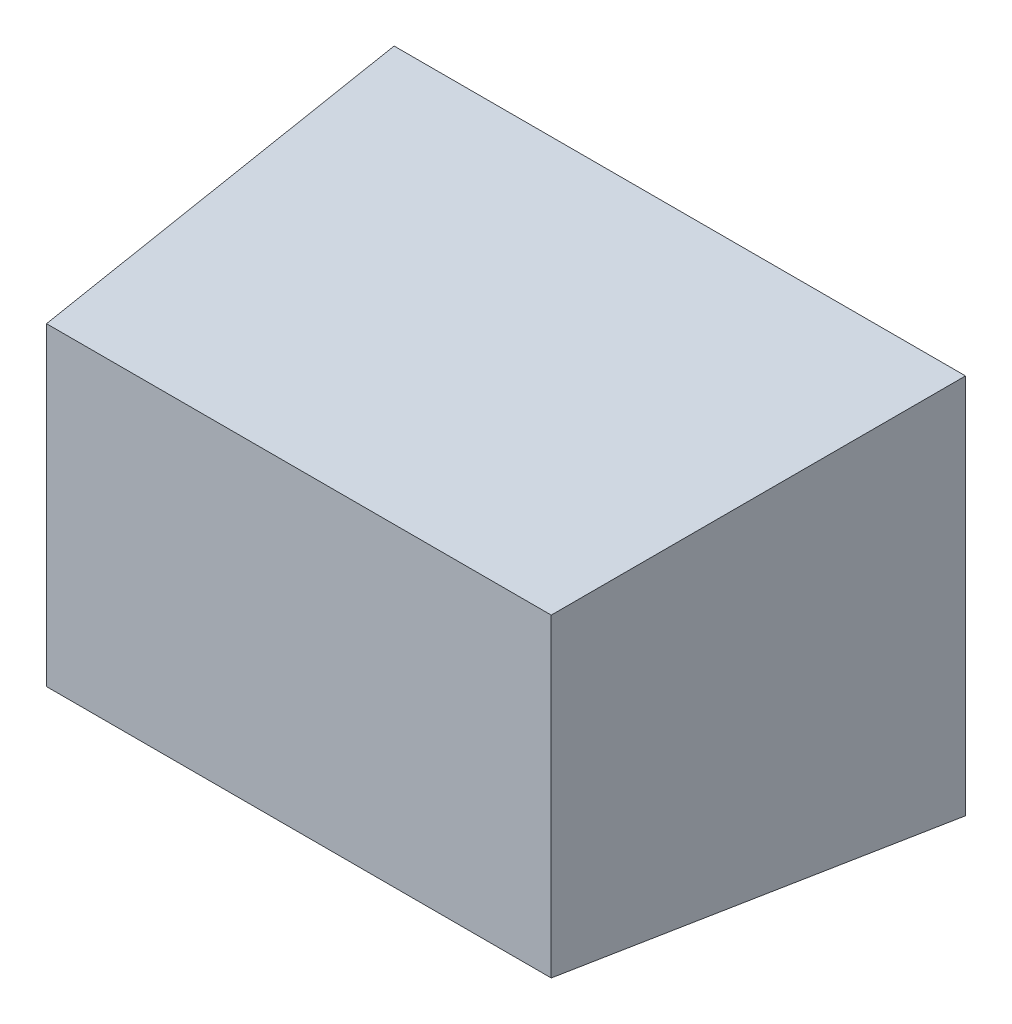
ISO-10303-21;
HEADER;
FILE_DESCRIPTION(('STEP AP214'),'2;1');
FILE_NAME('part.step','',(''),(''),'','','');
FILE_SCHEMA(('AUTOMOTIVE_DESIGN { 1 0 10303 214 1 1 1 1 }'));
ENDSEC;
DATA;
#1=APPLICATION_CONTEXT('core data for automotive mechanical design processes');
#2=APPLICATION_PROTOCOL_DEFINITION('international standard','automotive_design',2000,#1);
#3=PRODUCT_CONTEXT('',#1,'mechanical');
#4=PRODUCT('Part','Part','',(#3));
#5=PRODUCT_RELATED_PRODUCT_CATEGORY('part','',(#4));
#6=PRODUCT_DEFINITION_FORMATION('','',#4);
#7=PRODUCT_DEFINITION_CONTEXT('part definition',#1,'design');
#8=PRODUCT_DEFINITION('design','',#6,#7);
#9=PRODUCT_DEFINITION_SHAPE('','',#8);
#10=(LENGTH_UNIT() NAMED_UNIT(*) SI_UNIT(.MILLI.,.METRE.));
#11=(NAMED_UNIT(*) PLANE_ANGLE_UNIT() SI_UNIT($,.RADIAN.));
#12=(NAMED_UNIT(*) SI_UNIT($,.STERADIAN.) SOLID_ANGLE_UNIT());
#13=UNCERTAINTY_MEASURE_WITH_UNIT(LENGTH_MEASURE(1.E-05),#10,'distance_accuracy_value','');
#14=(GEOMETRIC_REPRESENTATION_CONTEXT(3) GLOBAL_UNCERTAINTY_ASSIGNED_CONTEXT((#13)) GLOBAL_UNIT_ASSIGNED_CONTEXT((#10,
#11,#12)) REPRESENTATION_CONTEXT('',''));
#15=CARTESIAN_POINT('',(0.,0.,0.));
#16=DIRECTION('',(0.,0.,1.));
#17=DIRECTION('',(1.,0.,0.));
#18=AXIS2_PLACEMENT_3D('',#15,#16,#17);
#19=CARTESIAN_POINT('',(75.,50.,0.));
#20=DIRECTION('',(0.996194698091746,0.,0.0871557427476584));
#21=DIRECTION('',(0.0871557427476584,0.,-0.996194698091746));
#22=AXIS2_PLACEMENT_3D('',#19,#20,#21);
#23=PLANE('',#22);
#24=DIRECTION('',(0.,1.,0.));
#25=VECTOR('',#24,1.);
#26=CARTESIAN_POINT('',(75.,50.,0.));
#27=LINE('',#26,#25);
#28=CARTESIAN_POINT('',(75.,-50.,0.));
#29=VERTEX_POINT('',#28);
#30=CARTESIAN_POINT('',(75.,50.,0.));
#31=VERTEX_POINT('',#30);
#32=EDGE_CURVE('E90',#29,#31,#27,.T.);
#33=ORIENTED_EDGE('',*,*,#32,.T.);
#34=DIRECTION('',(0.0868265938642478,0.0868265938642478,-0.992432509138967));
#35=VECTOR('',#34,1.);
#36=CARTESIAN_POINT('',(73.86917138969,48.86917138969,12.9254301613028));
#37=LINE('',#36,#35);
#38=CARTESIAN_POINT('',(66.2511336474076,41.2511336474076,100.));
#39=VERTEX_POINT('',#38);
#40=EDGE_CURVE('E11',#39,#31,#37,.T.);
#41=ORIENTED_EDGE('',*,*,#40,.F.);
#42=DIRECTION('',(0.,-1.,0.));
#43=VECTOR('',#42,1.);
#44=CARTESIAN_POINT('',(66.2511336474076,50.,100.));
#45=LINE('',#44,#43);
#46=CARTESIAN_POINT('',(66.2511336474076,-41.2511336474076,100.));
#47=VERTEX_POINT('',#46);
#48=EDGE_CURVE('E110',#47,#39,#45,.F.);
#49=ORIENTED_EDGE('',*,*,#48,.F.);
#50=DIRECTION('',(0.0868265938642478,-0.0868265938642478,-0.992432509138967));
#51=VECTOR('',#50,1.);
#52=CARTESIAN_POINT('',(74.2461142597933,-49.2461142597933,8.61695344086855));
#53=LINE('',#52,#51);
#54=EDGE_CURVE('E102',#47,#29,#53,.T.);
#55=ORIENTED_EDGE('',*,*,#54,.T.);
#56=EDGE_LOOP('',(#33,#41,#49,#55));
#57=FACE_BOUND('',#56,.T.);
#58=ADVANCED_FACE('F43',(#57),#23,.T.);
#59=CARTESIAN_POINT('',(-75.,50.,0.));
#60=DIRECTION('',(0.,0.996194698091746,0.0871557427476584));
#61=DIRECTION('',(0.,-0.0871557427476584,0.996194698091746));
#62=AXIS2_PLACEMENT_3D('',#59,#60,#61);
#63=PLANE('',#62);
#64=DIRECTION('',(-1.,0.,0.));
#65=VECTOR('',#64,1.);
#66=CARTESIAN_POINT('',(-75.,50.,0.));
#67=LINE('',#66,#65);
#68=CARTESIAN_POINT('',(-75.,50.,0.));
#69=VERTEX_POINT('',#68);
#70=EDGE_CURVE('E86',#31,#69,#67,.T.);
#71=ORIENTED_EDGE('',*,*,#70,.T.);
#72=DIRECTION('',(-0.0868265938642478,0.0868265938642478,-0.992432509138967));
#73=VECTOR('',#72,1.);
#74=CARTESIAN_POINT('',(-75.,50.,0.));
#75=LINE('',#74,#73);
#76=CARTESIAN_POINT('',(-66.2511336474076,41.2511336474076,100.));
#77=VERTEX_POINT('',#76);
#78=EDGE_CURVE('E53',#77,#69,#75,.T.);
#79=ORIENTED_EDGE('',*,*,#78,.F.);
#80=DIRECTION('',(1.,0.,0.));
#81=VECTOR('',#80,1.);
#82=CARTESIAN_POINT('',(-75.,41.2511336474076,100.));
#83=LINE('',#82,#81);
#84=EDGE_CURVE('E98',#39,#77,#83,.F.);
#85=ORIENTED_EDGE('',*,*,#84,.F.);
#86=ORIENTED_EDGE('',*,*,#40,.T.);
#87=EDGE_LOOP('',(#71,#79,#85,#86));
#88=FACE_BOUND('',#87,.T.);
#89=ADVANCED_FACE('F45',(#88),#63,.T.);
#90=CARTESIAN_POINT('',(-75.,50.,0.));
#91=DIRECTION('',(-0.996194698091746,0.,0.0871557427476584));
#92=DIRECTION('',(0.0871557427476584,0.,0.996194698091746));
#93=AXIS2_PLACEMENT_3D('',#90,#91,#92);
#94=PLANE('',#93);
#95=DIRECTION('',(0.,-1.,0.));
#96=VECTOR('',#95,1.);
#97=CARTESIAN_POINT('',(-75.,50.,0.));
#98=LINE('',#97,#96);
#99=CARTESIAN_POINT('',(-75.,-50.,0.));
#100=VERTEX_POINT('',#99);
#101=EDGE_CURVE('E91',#69,#100,#98,.T.);
#102=ORIENTED_EDGE('',*,*,#101,.T.);
#103=DIRECTION('',(-0.0868265938642478,-0.0868265938642478,-0.992432509138967));
#104=VECTOR('',#103,1.);
#105=CARTESIAN_POINT('',(-75.,-50.,0.));
#106=LINE('',#105,#104);
#107=CARTESIAN_POINT('',(-66.2511336474075,-41.2511336474076,100.));
#108=VERTEX_POINT('',#107);
#109=EDGE_CURVE('E114',#108,#100,#106,.T.);
#110=ORIENTED_EDGE('',*,*,#109,.F.);
#111=DIRECTION('',(0.,1.,0.));
#112=VECTOR('',#111,1.);
#113=CARTESIAN_POINT('',(-66.2511336474076,50.,100.));
#114=LINE('',#113,#112);
#115=EDGE_CURVE('E65',#77,#108,#114,.F.);
#116=ORIENTED_EDGE('',*,*,#115,.F.);
#117=ORIENTED_EDGE('',*,*,#78,.T.);
#118=EDGE_LOOP('',(#102,#110,#116,#117));
#119=FACE_BOUND('',#118,.T.);
#120=ADVANCED_FACE('F127',(#119),#94,.T.);
#121=CARTESIAN_POINT('',(-75.,-50.,0.));
#122=DIRECTION('',(0.,-0.996194698091746,0.0871557427476584));
#123=DIRECTION('',(0.,-0.0871557427476584,-0.996194698091746));
#124=AXIS2_PLACEMENT_3D('',#121,#122,#123);
#125=PLANE('',#124);
#126=DIRECTION('',(1.,0.,0.));
#127=VECTOR('',#126,1.);
#128=CARTESIAN_POINT('',(-75.,-50.,0.));
#129=LINE('',#128,#127);
#130=EDGE_CURVE('E108',#100,#29,#129,.T.);
#131=ORIENTED_EDGE('',*,*,#130,.T.);
#132=ORIENTED_EDGE('',*,*,#54,.F.);
#133=DIRECTION('',(-1.,0.,0.));
#134=VECTOR('',#133,1.);
#135=CARTESIAN_POINT('',(-75.,-41.2511336474076,100.));
#136=LINE('',#135,#134);
#137=EDGE_CURVE('E47',#108,#47,#136,.F.);
#138=ORIENTED_EDGE('',*,*,#137,.F.);
#139=ORIENTED_EDGE('',*,*,#109,.T.);
#140=EDGE_LOOP('',(#131,#132,#138,#139));
#141=FACE_BOUND('',#140,.T.);
#142=ADVANCED_FACE('F129',(#141),#125,.T.);
#143=CARTESIAN_POINT('',(0.,0.,100.));
#144=DIRECTION('',(0.,0.,1.));
#145=DIRECTION('',(1.,0.,0.));
#146=AXIS2_PLACEMENT_3D('',#143,#144,#145);
#147=PLANE('',#146);
#148=ORIENTED_EDGE('',*,*,#48,.T.);
#149=ORIENTED_EDGE('',*,*,#84,.T.);
#150=ORIENTED_EDGE('',*,*,#115,.T.);
#151=ORIENTED_EDGE('',*,*,#137,.T.);
#152=EDGE_LOOP('',(#148,#149,#150,#151));
#153=FACE_BOUND('',#152,.T.);
#154=ADVANCED_FACE('F125',(#153),#147,.T.);
#155=CARTESIAN_POINT('',(0.,0.,0.));
#156=DIRECTION('',(0.,0.,1.));
#157=DIRECTION('',(1.,0.,0.));
#158=AXIS2_PLACEMENT_3D('',#155,#156,#157);
#159=PLANE('',#158);
#160=ORIENTED_EDGE('',*,*,#32,.F.);
#161=ORIENTED_EDGE('',*,*,#130,.F.);
#162=ORIENTED_EDGE('',*,*,#101,.F.);
#163=ORIENTED_EDGE('',*,*,#70,.F.);
#164=EDGE_LOOP('',(#160,#161,#162,#163));
#165=FACE_BOUND('',#164,.T.);
#166=ADVANCED_FACE('F87',(#165),#159,.F.);
#167=CLOSED_SHELL('',(#58,#89,#120,#142,#154,#166));
#168=MANIFOLD_SOLID_BREP('B2',#167);
#169=ADVANCED_BREP_SHAPE_REPRESENTATION('',(#18,#168),#14);
#170=SHAPE_DEFINITION_REPRESENTATION(#9,#169);
ENDSEC;
END-ISO-10303-21;
